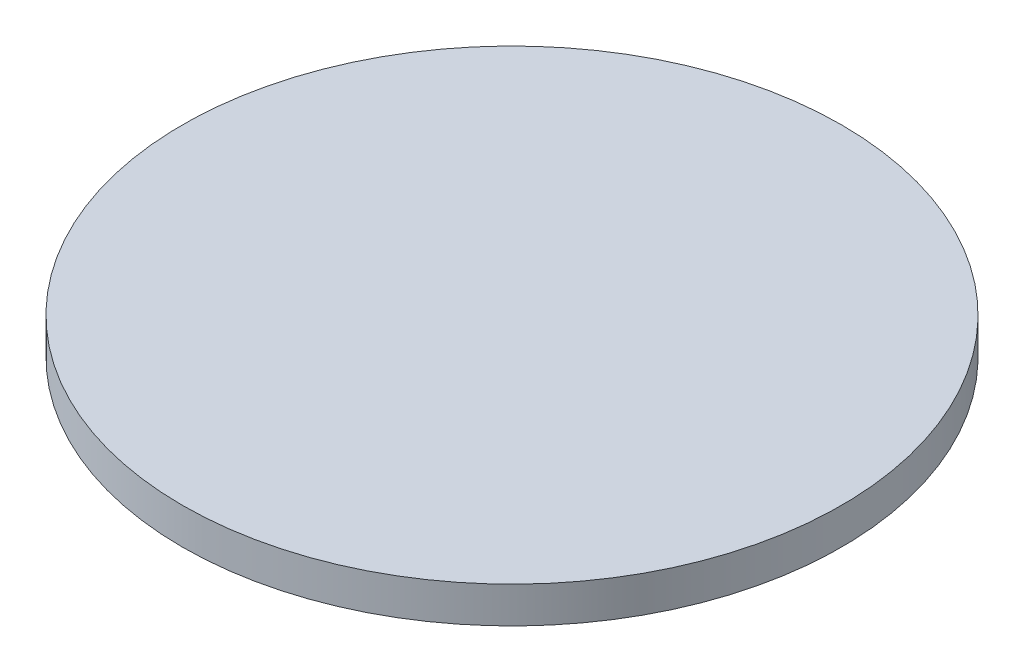
ISO-10303-21;
HEADER;
FILE_DESCRIPTION(('STEP AP214'),'2;1');
FILE_NAME('part.step','',(''),(''),'','','');
FILE_SCHEMA(('AUTOMOTIVE_DESIGN { 1 0 10303 214 1 1 1 1 }'));
ENDSEC;
DATA;
#1=APPLICATION_CONTEXT('core data for automotive mechanical design processes');
#2=APPLICATION_PROTOCOL_DEFINITION('international standard','automotive_design',2000,#1);
#3=PRODUCT_CONTEXT('',#1,'mechanical');
#4=PRODUCT('Part','Part','',(#3));
#5=PRODUCT_RELATED_PRODUCT_CATEGORY('part','',(#4));
#6=PRODUCT_DEFINITION_FORMATION('','',#4);
#7=PRODUCT_DEFINITION_CONTEXT('part definition',#1,'design');
#8=PRODUCT_DEFINITION('design','',#6,#7);
#9=PRODUCT_DEFINITION_SHAPE('','',#8);
#10=(LENGTH_UNIT() NAMED_UNIT(*) SI_UNIT(.MILLI.,.METRE.));
#11=(NAMED_UNIT(*) PLANE_ANGLE_UNIT() SI_UNIT($,.RADIAN.));
#12=(NAMED_UNIT(*) SI_UNIT($,.STERADIAN.) SOLID_ANGLE_UNIT());
#13=UNCERTAINTY_MEASURE_WITH_UNIT(LENGTH_MEASURE(1.E-05),#10,'distance_accuracy_value','');
#14=(GEOMETRIC_REPRESENTATION_CONTEXT(3) GLOBAL_UNCERTAINTY_ASSIGNED_CONTEXT((#13)) GLOBAL_UNIT_ASSIGNED_CONTEXT((#10,
#11,#12)) REPRESENTATION_CONTEXT('',''));
#15=CARTESIAN_POINT('',(0.,0.,0.));
#16=DIRECTION('',(0.,0.,1.));
#17=DIRECTION('',(1.,0.,0.));
#18=AXIS2_PLACEMENT_3D('',#15,#16,#17);
#19=CARTESIAN_POINT('',(0.,3.,0.));
#20=DIRECTION('',(0.,-1.,0.));
#21=DIRECTION('',(0.,0.,-1.));
#22=AXIS2_PLACEMENT_3D('',#19,#20,#21);
#23=CYLINDRICAL_SURFACE('',#22,27.3);
#24=CARTESIAN_POINT('',(0.,3.,0.));
#25=DIRECTION('',(0.,1.,0.));
#26=DIRECTION('',(0.,0.,1.));
#27=AXIS2_PLACEMENT_3D('',#24,#25,#26);
#28=CIRCLE('',#27,27.3);
#29=CARTESIAN_POINT('',(0.,3.,27.3));
#30=VERTEX_POINT('',#29);
#31=EDGE_CURVE('E10',#30,#30,#28,.T.);
#32=ORIENTED_EDGE('',*,*,#31,.F.);
#33=EDGE_LOOP('',(#32));
#34=FACE_BOUND('',#33,.T.);
#35=CARTESIAN_POINT('',(0.,0.,0.));
#36=DIRECTION('',(0.,1.,0.));
#37=DIRECTION('',(0.,0.,1.));
#38=AXIS2_PLACEMENT_3D('',#35,#36,#37);
#39=CIRCLE('',#38,27.3);
#40=CARTESIAN_POINT('',(0.,0.,27.3));
#41=VERTEX_POINT('',#40);
#42=EDGE_CURVE('E34',#41,#41,#39,.T.);
#43=ORIENTED_EDGE('',*,*,#42,.T.);
#44=EDGE_LOOP('',(#43));
#45=FACE_BOUND('',#44,.T.);
#46=ADVANCED_FACE('F31',(#34,#45),#23,.T.);
#47=CARTESIAN_POINT('',(0.,3.,0.));
#48=DIRECTION('',(0.,1.,0.));
#49=DIRECTION('',(0.,0.,1.));
#50=AXIS2_PLACEMENT_3D('',#47,#48,#49);
#51=PLANE('',#50);
#52=ORIENTED_EDGE('',*,*,#31,.T.);
#53=EDGE_LOOP('',(#52));
#54=FACE_BOUND('',#53,.T.);
#55=ADVANCED_FACE('F46',(#54),#51,.T.);
#56=CARTESIAN_POINT('',(0.,0.,0.));
#57=DIRECTION('',(0.,1.,0.));
#58=DIRECTION('',(0.,0.,1.));
#59=AXIS2_PLACEMENT_3D('',#56,#57,#58);
#60=PLANE('',#59);
#61=ORIENTED_EDGE('',*,*,#42,.F.);
#62=EDGE_LOOP('',(#61));
#63=FACE_BOUND('',#62,.T.);
#64=ADVANCED_FACE('F44',(#63),#60,.F.);
#65=CLOSED_SHELL('',(#46,#55,#64));
#66=MANIFOLD_SOLID_BREP('B2',#65);
#67=ADVANCED_BREP_SHAPE_REPRESENTATION('',(#18,#66),#14);
#68=SHAPE_DEFINITION_REPRESENTATION(#9,#67);
ENDSEC;
END-ISO-10303-21;
